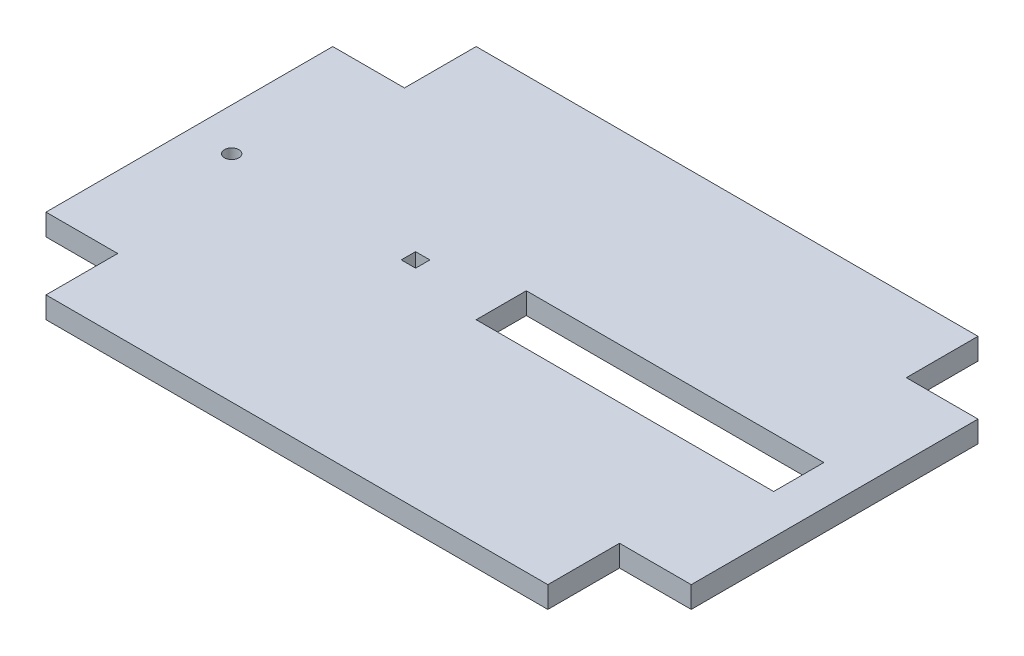
ISO-10303-21;
HEADER;
FILE_DESCRIPTION(('STEP AP214'),'2;1');
FILE_NAME('part.step','',(''),(''),'','','');
FILE_SCHEMA(('AUTOMOTIVE_DESIGN { 1 0 10303 214 1 1 1 1 }'));
ENDSEC;
DATA;
#1=APPLICATION_CONTEXT('core data for automotive mechanical design processes');
#2=APPLICATION_PROTOCOL_DEFINITION('international standard','automotive_design',2000,#1);
#3=PRODUCT_CONTEXT('',#1,'mechanical');
#4=PRODUCT('Part','Part','',(#3));
#5=PRODUCT_RELATED_PRODUCT_CATEGORY('part','',(#4));
#6=PRODUCT_DEFINITION_FORMATION('','',#4);
#7=PRODUCT_DEFINITION_CONTEXT('part definition',#1,'design');
#8=PRODUCT_DEFINITION('design','',#6,#7);
#9=PRODUCT_DEFINITION_SHAPE('','',#8);
#10=(LENGTH_UNIT() NAMED_UNIT(*) SI_UNIT(.MILLI.,.METRE.));
#11=(NAMED_UNIT(*) PLANE_ANGLE_UNIT() SI_UNIT($,.RADIAN.));
#12=(NAMED_UNIT(*) SI_UNIT($,.STERADIAN.) SOLID_ANGLE_UNIT());
#13=UNCERTAINTY_MEASURE_WITH_UNIT(LENGTH_MEASURE(1.E-05),#10,'distance_accuracy_value','');
#14=(GEOMETRIC_REPRESENTATION_CONTEXT(3) GLOBAL_UNCERTAINTY_ASSIGNED_CONTEXT((#13)) GLOBAL_UNIT_ASSIGNED_CONTEXT((#10,
#11,#12)) REPRESENTATION_CONTEXT('',''));
#15=CARTESIAN_POINT('',(0.,0.,0.));
#16=DIRECTION('',(0.,0.,1.));
#17=DIRECTION('',(1.,0.,0.));
#18=AXIS2_PLACEMENT_3D('',#15,#16,#17);
#19=CARTESIAN_POINT('',(-401.785237046629,30.,-228.803641092328));
#20=DIRECTION('',(0.,0.,1.));
#21=DIRECTION('',(1.,0.,0.));
#22=AXIS2_PLACEMENT_3D('',#19,#20,#21);
#23=PLANE('',#22);
#24=DIRECTION('',(-1.,0.,0.));
#25=VECTOR('',#24,1.);
#26=CARTESIAN_POINT('',(-401.785237046629,30.,-228.803641092328));
#27=LINE('',#26,#25);
#28=CARTESIAN_POINT('',(398.214762953372,30.,-228.803641092328));
#29=VERTEX_POINT('',#28);
#30=CARTESIAN_POINT('',(-301.785237046629,30.,-228.803641092328));
#31=VERTEX_POINT('',#30);
#32=EDGE_CURVE('E298',#29,#31,#27,.T.);
#33=ORIENTED_EDGE('',*,*,#32,.F.);
#34=DIRECTION('',(0.,1.,0.));
#35=VECTOR('',#34,1.);
#36=CARTESIAN_POINT('',(398.214762953372,0.,-228.803641092328));
#37=LINE('',#36,#35);
#38=CARTESIAN_POINT('',(398.214762953372,0.,-228.803641092328));
#39=VERTEX_POINT('',#38);
#40=EDGE_CURVE('E269',#39,#29,#37,.T.);
#41=ORIENTED_EDGE('',*,*,#40,.F.);
#42=DIRECTION('',(-1.,0.,0.));
#43=VECTOR('',#42,1.);
#44=CARTESIAN_POINT('',(-401.785237046629,0.,-228.803641092328));
#45=LINE('',#44,#43);
#46=CARTESIAN_POINT('',(-301.785237046629,0.,-228.803641092328));
#47=VERTEX_POINT('',#46);
#48=EDGE_CURVE('E294',#39,#47,#45,.T.);
#49=ORIENTED_EDGE('',*,*,#48,.T.);
#50=DIRECTION('',(0.,1.,0.));
#51=VECTOR('',#50,1.);
#52=CARTESIAN_POINT('',(-301.785237046629,0.,-228.803641092328));
#53=LINE('',#52,#51);
#54=EDGE_CURVE('E291',#47,#31,#53,.T.);
#55=ORIENTED_EDGE('',*,*,#54,.T.);
#56=EDGE_LOOP('',(#33,#41,#49,#55));
#57=FACE_BOUND('',#56,.T.);
#58=ADVANCED_FACE('F37',(#57),#23,.F.);
#59=CARTESIAN_POINT('',(-401.785237046629,30.,-228.803641092328));
#60=DIRECTION('',(1.,0.,0.));
#61=DIRECTION('',(0.,0.,-1.));
#62=AXIS2_PLACEMENT_3D('',#59,#60,#61);
#63=PLANE('',#62);
#64=DIRECTION('',(0.,0.,1.));
#65=VECTOR('',#64,1.);
#66=CARTESIAN_POINT('',(-401.785237046629,0.,-228.803641092328));
#67=LINE('',#66,#65);
#68=CARTESIAN_POINT('',(-401.785237046629,0.,-128.803641092328));
#69=VERTEX_POINT('',#68);
#70=CARTESIAN_POINT('',(-401.785237046629,0.,271.196358907672));
#71=VERTEX_POINT('',#70);
#72=EDGE_CURVE('E314',#69,#71,#67,.T.);
#73=ORIENTED_EDGE('',*,*,#72,.T.);
#74=DIRECTION('',(0.,1.,0.));
#75=VECTOR('',#74,1.);
#76=CARTESIAN_POINT('',(-401.785237046629,0.,271.196358907672));
#77=LINE('',#76,#75);
#78=CARTESIAN_POINT('',(-401.785237046629,30.,271.196358907672));
#79=VERTEX_POINT('',#78);
#80=EDGE_CURVE('E230',#71,#79,#77,.T.);
#81=ORIENTED_EDGE('',*,*,#80,.T.);
#82=DIRECTION('',(0.,0.,1.));
#83=VECTOR('',#82,1.);
#84=CARTESIAN_POINT('',(-401.785237046629,30.,-228.803641092328));
#85=LINE('',#84,#83);
#86=CARTESIAN_POINT('',(-401.785237046629,30.,-128.803641092328));
#87=VERTEX_POINT('',#86);
#88=EDGE_CURVE('E301',#87,#79,#85,.T.);
#89=ORIENTED_EDGE('',*,*,#88,.F.);
#90=DIRECTION('',(0.,1.,0.));
#91=VECTOR('',#90,1.);
#92=CARTESIAN_POINT('',(-401.785237046629,0.,-128.803641092328));
#93=LINE('',#92,#91);
#94=EDGE_CURVE('E287',#69,#87,#93,.T.);
#95=ORIENTED_EDGE('',*,*,#94,.F.);
#96=EDGE_LOOP('',(#73,#81,#89,#95));
#97=FACE_BOUND('',#96,.T.);
#98=ADVANCED_FACE('F359',(#97),#63,.F.);
#99=CARTESIAN_POINT('',(-401.785237046629,30.,371.196358907672));
#100=DIRECTION('',(0.,0.,-1.));
#101=DIRECTION('',(-1.,0.,0.));
#102=AXIS2_PLACEMENT_3D('',#99,#100,#101);
#103=PLANE('',#102);
#104=DIRECTION('',(1.,0.,0.));
#105=VECTOR('',#104,1.);
#106=CARTESIAN_POINT('',(-401.785237046629,0.,371.196358907672));
#107=LINE('',#106,#105);
#108=CARTESIAN_POINT('',(-301.785237046629,0.,371.196358907672));
#109=VERTEX_POINT('',#108);
#110=CARTESIAN_POINT('',(398.214762953372,0.,371.196358907672));
#111=VERTEX_POINT('',#110);
#112=EDGE_CURVE('E317',#109,#111,#107,.T.);
#113=ORIENTED_EDGE('',*,*,#112,.T.);
#114=DIRECTION('',(0.,1.,0.));
#115=VECTOR('',#114,1.);
#116=CARTESIAN_POINT('',(398.214762953372,0.,371.196358907672));
#117=LINE('',#116,#115);
#118=CARTESIAN_POINT('',(398.214762953372,30.,371.196358907672));
#119=VERTEX_POINT('',#118);
#120=EDGE_CURVE('E250',#111,#119,#117,.T.);
#121=ORIENTED_EDGE('',*,*,#120,.T.);
#122=DIRECTION('',(1.,0.,0.));
#123=VECTOR('',#122,1.);
#124=CARTESIAN_POINT('',(-401.785237046629,30.,371.196358907672));
#125=LINE('',#124,#123);
#126=CARTESIAN_POINT('',(-301.785237046629,30.,371.196358907672));
#127=VERTEX_POINT('',#126);
#128=EDGE_CURVE('E305',#127,#119,#125,.T.);
#129=ORIENTED_EDGE('',*,*,#128,.F.);
#130=DIRECTION('',(0.,1.,0.));
#131=VECTOR('',#130,1.);
#132=CARTESIAN_POINT('',(-301.785237046629,0.,371.196358907672));
#133=LINE('',#132,#131);
#134=EDGE_CURVE('E225',#109,#127,#133,.T.);
#135=ORIENTED_EDGE('',*,*,#134,.F.);
#136=EDGE_LOOP('',(#113,#121,#129,#135));
#137=FACE_BOUND('',#136,.T.);
#138=ADVANCED_FACE('F364',(#137),#103,.F.);
#139=CARTESIAN_POINT('',(498.214762953372,30.,371.196358907672));
#140=DIRECTION('',(-1.,0.,0.));
#141=DIRECTION('',(0.,0.,1.));
#142=AXIS2_PLACEMENT_3D('',#139,#140,#141);
#143=PLANE('',#142);
#144=DIRECTION('',(0.,0.,-1.));
#145=VECTOR('',#144,1.);
#146=CARTESIAN_POINT('',(498.214762953372,0.,371.196358907672));
#147=LINE('',#146,#145);
#148=CARTESIAN_POINT('',(498.214762953372,0.,271.196358907672));
#149=VERTEX_POINT('',#148);
#150=CARTESIAN_POINT('',(498.214762953371,0.,-128.803641092328));
#151=VERTEX_POINT('',#150);
#152=EDGE_CURVE('E302',#149,#151,#147,.T.);
#153=ORIENTED_EDGE('',*,*,#152,.T.);
#154=DIRECTION('',(0.,1.,0.));
#155=VECTOR('',#154,1.);
#156=CARTESIAN_POINT('',(498.214762953372,0.,-128.803641092328));
#157=LINE('',#156,#155);
#158=CARTESIAN_POINT('',(498.214762953372,30.,-128.803641092328));
#159=VERTEX_POINT('',#158);
#160=EDGE_CURVE('E266',#151,#159,#157,.T.);
#161=ORIENTED_EDGE('',*,*,#160,.T.);
#162=DIRECTION('',(0.,0.,-1.));
#163=VECTOR('',#162,1.);
#164=CARTESIAN_POINT('',(498.214762953372,30.,371.196358907672));
#165=LINE('',#164,#163);
#166=CARTESIAN_POINT('',(498.214762953372,30.,271.196358907672));
#167=VERTEX_POINT('',#166);
#168=EDGE_CURVE('E308',#167,#159,#165,.T.);
#169=ORIENTED_EDGE('',*,*,#168,.F.);
#170=DIRECTION('',(0.,1.,0.));
#171=VECTOR('',#170,1.);
#172=CARTESIAN_POINT('',(498.214762953372,0.,271.196358907672));
#173=LINE('',#172,#171);
#174=EDGE_CURVE('E245',#149,#167,#173,.T.);
#175=ORIENTED_EDGE('',*,*,#174,.F.);
#176=EDGE_LOOP('',(#153,#161,#169,#175));
#177=FACE_BOUND('',#176,.T.);
#178=ADVANCED_FACE('F408',(#177),#143,.F.);
#179=CARTESIAN_POINT('',(0.,30.,0.));
#180=DIRECTION('',(0.,1.,0.));
#181=DIRECTION('',(0.,0.,1.));
#182=AXIS2_PLACEMENT_3D('',#179,#180,#181);
#183=PLANE('',#182);
#184=DIRECTION('',(-1.,0.,0.));
#185=VECTOR('',#184,1.);
#186=CARTESIAN_POINT('',(443.214762953372,30.,31.1963589076722));
#187=LINE('',#186,#185);
#188=CARTESIAN_POINT('',(443.214762953372,30.,31.1963589076722));
#189=VERTEX_POINT('',#188);
#190=CARTESIAN_POINT('',(28.2147629533715,30.,31.1963589076723));
#191=VERTEX_POINT('',#190);
#192=EDGE_CURVE('E51',#189,#191,#187,.T.);
#193=ORIENTED_EDGE('',*,*,#192,.F.);
#194=DIRECTION('',(0.,0.,-1.));
#195=VECTOR('',#194,1.);
#196=CARTESIAN_POINT('',(443.214762953372,30.,31.1963589076722));
#197=LINE('',#196,#195);
#198=CARTESIAN_POINT('',(443.214762953371,30.,101.196358907672));
#199=VERTEX_POINT('',#198);
#200=EDGE_CURVE('E192',#199,#189,#197,.T.);
#201=ORIENTED_EDGE('',*,*,#200,.F.);
#202=DIRECTION('',(1.,0.,0.));
#203=VECTOR('',#202,1.);
#204=CARTESIAN_POINT('',(28.2147629533716,30.,101.196358907672));
#205=LINE('',#204,#203);
#206=CARTESIAN_POINT('',(28.2147629533716,30.,101.196358907672));
#207=VERTEX_POINT('',#206);
#208=EDGE_CURVE('E176',#207,#199,#205,.T.);
#209=ORIENTED_EDGE('',*,*,#208,.F.);
#210=DIRECTION('',(0.,0.,1.));
#211=VECTOR('',#210,1.);
#212=CARTESIAN_POINT('',(28.2147629533715,30.,31.1963589076723));
#213=LINE('',#212,#211);
#214=EDGE_CURVE('E185',#191,#207,#213,.T.);
#215=ORIENTED_EDGE('',*,*,#214,.F.);
#216=EDGE_LOOP('',(#193,#201,#209,#215));
#217=FACE_BOUND('',#216,.T.);
#218=DIRECTION('',(0.,0.,-1.));
#219=VECTOR('',#218,1.);
#220=CARTESIAN_POINT('',(-76.2852370466286,30.,81.1963589076723));
#221=LINE('',#220,#219);
#222=CARTESIAN_POINT('',(-76.2852370466286,30.,81.1963589076723));
#223=VERTEX_POINT('',#222);
#224=CARTESIAN_POINT('',(-76.2852370466286,30.,61.1963589076723));
#225=VERTEX_POINT('',#224);
#226=EDGE_CURVE('E202',#223,#225,#221,.T.);
#227=ORIENTED_EDGE('',*,*,#226,.F.);
#228=DIRECTION('',(1.,0.,0.));
#229=VECTOR('',#228,1.);
#230=CARTESIAN_POINT('',(-96.2852370466286,30.,81.1963589076723));
#231=LINE('',#230,#229);
#232=CARTESIAN_POINT('',(-96.2852370466286,30.,81.1963589076723));
#233=VERTEX_POINT('',#232);
#234=EDGE_CURVE('E210',#233,#223,#231,.T.);
#235=ORIENTED_EDGE('',*,*,#234,.F.);
#236=DIRECTION('',(0.,0.,1.));
#237=VECTOR('',#236,1.);
#238=CARTESIAN_POINT('',(-96.2852370466286,30.,81.1963589076723));
#239=LINE('',#238,#237);
#240=CARTESIAN_POINT('',(-96.2852370466286,30.,61.1963589076723));
#241=VERTEX_POINT('',#240);
#242=EDGE_CURVE('E207',#241,#233,#239,.T.);
#243=ORIENTED_EDGE('',*,*,#242,.F.);
#244=DIRECTION('',(-1.,0.,0.));
#245=VECTOR('',#244,1.);
#246=CARTESIAN_POINT('',(-96.2852370466286,30.,61.1963589076723));
#247=LINE('',#246,#245);
#248=EDGE_CURVE('E204',#225,#241,#247,.T.);
#249=ORIENTED_EDGE('',*,*,#248,.F.);
#250=EDGE_LOOP('',(#227,#235,#243,#249));
#251=FACE_BOUND('',#250,.T.);
#252=CARTESIAN_POINT('',(-342.785237046629,30.,71.1963589076723));
#253=DIRECTION('',(0.,1.,0.));
#254=DIRECTION('',(0.,0.,-1.));
#255=AXIS2_PLACEMENT_3D('',#252,#253,#254);
#256=CIRCLE('',#255,10.);
#257=CARTESIAN_POINT('',(-342.785237046629,30.,61.1963589076722));
#258=VERTEX_POINT('',#257);
#259=EDGE_CURVE('E199',#258,#258,#256,.T.);
#260=ORIENTED_EDGE('',*,*,#259,.F.);
#261=EDGE_LOOP('',(#260));
#262=FACE_BOUND('',#261,.T.);
#263=DIRECTION('',(0.,0.,1.));
#264=VECTOR('',#263,1.);
#265=CARTESIAN_POINT('',(398.214762953372,30.,-128.803641092328));
#266=LINE('',#265,#264);
#267=CARTESIAN_POINT('',(398.214762953372,30.,-128.803641092328));
#268=VERTEX_POINT('',#267);
#269=EDGE_CURVE('E253',#29,#268,#266,.T.);
#270=ORIENTED_EDGE('',*,*,#269,.F.);
#271=ORIENTED_EDGE('',*,*,#32,.T.);
#272=DIRECTION('',(0.,0.,-1.));
#273=VECTOR('',#272,1.);
#274=CARTESIAN_POINT('',(-301.785237046629,30.,-128.803641092328));
#275=LINE('',#274,#273);
#276=CARTESIAN_POINT('',(-301.785237046629,30.,-128.803641092328));
#277=VERTEX_POINT('',#276);
#278=EDGE_CURVE('E284',#277,#31,#275,.T.);
#279=ORIENTED_EDGE('',*,*,#278,.F.);
#280=DIRECTION('',(1.,0.,0.));
#281=VECTOR('',#280,1.);
#282=CARTESIAN_POINT('',(-401.785237046629,30.,-128.803641092328));
#283=LINE('',#282,#281);
#284=EDGE_CURVE('E240',#87,#277,#283,.T.);
#285=ORIENTED_EDGE('',*,*,#284,.F.);
#286=ORIENTED_EDGE('',*,*,#88,.T.);
#287=DIRECTION('',(-1.,0.,0.));
#288=VECTOR('',#287,1.);
#289=CARTESIAN_POINT('',(-301.785237046629,30.,271.196358907672));
#290=LINE('',#289,#288);
#291=CARTESIAN_POINT('',(-301.785237046629,30.,271.196358907672));
#292=VERTEX_POINT('',#291);
#293=EDGE_CURVE('E234',#292,#79,#290,.T.);
#294=ORIENTED_EDGE('',*,*,#293,.F.);
#295=DIRECTION('',(0.,0.,-1.));
#296=VECTOR('',#295,1.);
#297=CARTESIAN_POINT('',(-301.785237046629,30.,371.196358907672));
#298=LINE('',#297,#296);
#299=EDGE_CURVE('E236',#127,#292,#298,.T.);
#300=ORIENTED_EDGE('',*,*,#299,.F.);
#301=ORIENTED_EDGE('',*,*,#128,.T.);
#302=DIRECTION('',(0.,0.,1.));
#303=VECTOR('',#302,1.);
#304=CARTESIAN_POINT('',(398.214762953372,30.,271.196358907672));
#305=LINE('',#304,#303);
#306=CARTESIAN_POINT('',(398.214762953372,30.,271.196358907672));
#307=VERTEX_POINT('',#306);
#308=EDGE_CURVE('E254',#307,#119,#305,.T.);
#309=ORIENTED_EDGE('',*,*,#308,.F.);
#310=DIRECTION('',(-1.,0.,0.));
#311=VECTOR('',#310,1.);
#312=CARTESIAN_POINT('',(498.214762953372,30.,271.196358907672));
#313=LINE('',#312,#311);
#314=EDGE_CURVE('E233',#167,#307,#313,.T.);
#315=ORIENTED_EDGE('',*,*,#314,.F.);
#316=ORIENTED_EDGE('',*,*,#168,.T.);
#317=DIRECTION('',(1.,0.,0.));
#318=VECTOR('',#317,1.);
#319=CARTESIAN_POINT('',(498.214762953372,30.,-128.803641092328));
#320=LINE('',#319,#318);
#321=EDGE_CURVE('E271',#268,#159,#320,.T.);
#322=ORIENTED_EDGE('',*,*,#321,.F.);
#323=EDGE_LOOP('',(#270,#271,#279,#285,#286,#294,#300,#301,#309,#315,#316,#322));
#324=FACE_BOUND('',#323,.T.);
#325=ADVANCED_FACE('F189',(#217,#251,#262,#324),#183,.T.);
#326=CARTESIAN_POINT('',(0.,0.,0.));
#327=DIRECTION('',(0.,1.,0.));
#328=DIRECTION('',(0.,0.,1.));
#329=AXIS2_PLACEMENT_3D('',#326,#327,#328);
#330=PLANE('',#329);
#331=DIRECTION('',(0.,0.,-1.));
#332=VECTOR('',#331,1.);
#333=CARTESIAN_POINT('',(443.214762953372,0.,3.51476596203295E-13));
#334=LINE('',#333,#332);
#335=CARTESIAN_POINT('',(443.214762953371,0.,101.196358907672));
#336=VERTEX_POINT('',#335);
#337=CARTESIAN_POINT('',(443.214762953372,0.,31.1963589076722));
#338=VERTEX_POINT('',#337);
#339=EDGE_CURVE('E44',#336,#338,#334,.T.);
#340=ORIENTED_EDGE('',*,*,#339,.T.);
#341=DIRECTION('',(-1.,0.,0.));
#342=VECTOR('',#341,1.);
#343=CARTESIAN_POINT('',(0.,0.,31.1963589076723));
#344=LINE('',#343,#342);
#345=CARTESIAN_POINT('',(28.2147629533715,0.,31.1963589076723));
#346=VERTEX_POINT('',#345);
#347=EDGE_CURVE('E11',#338,#346,#344,.T.);
#348=ORIENTED_EDGE('',*,*,#347,.T.);
#349=DIRECTION('',(0.,0.,1.));
#350=VECTOR('',#349,1.);
#351=CARTESIAN_POINT('',(28.2147629533715,0.,0.));
#352=LINE('',#351,#350);
#353=CARTESIAN_POINT('',(28.2147629533716,0.,101.196358907672));
#354=VERTEX_POINT('',#353);
#355=EDGE_CURVE('E335',#346,#354,#352,.T.);
#356=ORIENTED_EDGE('',*,*,#355,.T.);
#357=DIRECTION('',(1.,0.,0.));
#358=VECTOR('',#357,1.);
#359=CARTESIAN_POINT('',(0.,0.,101.196358907672));
#360=LINE('',#359,#358);
#361=EDGE_CURVE('E179',#354,#336,#360,.T.);
#362=ORIENTED_EDGE('',*,*,#361,.T.);
#363=EDGE_LOOP('',(#340,#348,#356,#362));
#364=FACE_BOUND('',#363,.T.);
#365=DIRECTION('',(1.,0.,0.));
#366=VECTOR('',#365,1.);
#367=CARTESIAN_POINT('',(0.,0.,81.1963589076723));
#368=LINE('',#367,#366);
#369=CARTESIAN_POINT('',(-96.2852370466286,0.,81.1963589076723));
#370=VERTEX_POINT('',#369);
#371=CARTESIAN_POINT('',(-76.2852370466286,0.,81.1963589076723));
#372=VERTEX_POINT('',#371);
#373=EDGE_CURVE('E329',#370,#372,#368,.T.);
#374=ORIENTED_EDGE('',*,*,#373,.T.);
#375=DIRECTION('',(0.,0.,-1.));
#376=VECTOR('',#375,1.);
#377=CARTESIAN_POINT('',(-76.2852370466286,0.,0.));
#378=LINE('',#377,#376);
#379=CARTESIAN_POINT('',(-76.2852370466286,0.,61.1963589076723));
#380=VERTEX_POINT('',#379);
#381=EDGE_CURVE('E332',#372,#380,#378,.T.);
#382=ORIENTED_EDGE('',*,*,#381,.T.);
#383=DIRECTION('',(-1.,0.,0.));
#384=VECTOR('',#383,1.);
#385=CARTESIAN_POINT('',(0.,0.,61.1963589076723));
#386=LINE('',#385,#384);
#387=CARTESIAN_POINT('',(-96.2852370466286,0.,61.1963589076723));
#388=VERTEX_POINT('',#387);
#389=EDGE_CURVE('E311',#380,#388,#386,.T.);
#390=ORIENTED_EDGE('',*,*,#389,.T.);
#391=DIRECTION('',(0.,0.,1.));
#392=VECTOR('',#391,1.);
#393=CARTESIAN_POINT('',(-96.2852370466286,0.,0.));
#394=LINE('',#393,#392);
#395=EDGE_CURVE('E326',#388,#370,#394,.T.);
#396=ORIENTED_EDGE('',*,*,#395,.T.);
#397=EDGE_LOOP('',(#374,#382,#390,#396));
#398=FACE_BOUND('',#397,.T.);
#399=CARTESIAN_POINT('',(-342.785237046629,0.,71.1963589076723));
#400=DIRECTION('',(0.,1.,0.));
#401=DIRECTION('',(0.,0.,1.));
#402=AXIS2_PLACEMENT_3D('',#399,#400,#401);
#403=CIRCLE('',#402,10.);
#404=CARTESIAN_POINT('',(-342.785237046629,0.,81.1963589076723));
#405=VERTEX_POINT('',#404);
#406=EDGE_CURVE('E216',#405,#405,#403,.T.);
#407=ORIENTED_EDGE('',*,*,#406,.T.);
#408=EDGE_LOOP('',(#407));
#409=FACE_BOUND('',#408,.T.);
#410=ORIENTED_EDGE('',*,*,#48,.F.);
#411=DIRECTION('',(0.,0.,1.));
#412=VECTOR('',#411,1.);
#413=CARTESIAN_POINT('',(398.214762953372,0.,-128.803641092328));
#414=LINE('',#413,#412);
#415=CARTESIAN_POINT('',(398.214762953372,0.,-128.803641092328));
#416=VERTEX_POINT('',#415);
#417=EDGE_CURVE('E273',#39,#416,#414,.T.);
#418=ORIENTED_EDGE('',*,*,#417,.T.);
#419=DIRECTION('',(1.,0.,0.));
#420=VECTOR('',#419,1.);
#421=CARTESIAN_POINT('',(498.214762953372,0.,-128.803641092328));
#422=LINE('',#421,#420);
#423=EDGE_CURVE('E265',#416,#151,#422,.T.);
#424=ORIENTED_EDGE('',*,*,#423,.T.);
#425=ORIENTED_EDGE('',*,*,#152,.F.);
#426=DIRECTION('',(-1.,0.,0.));
#427=VECTOR('',#426,1.);
#428=CARTESIAN_POINT('',(498.214762953372,0.,271.196358907672));
#429=LINE('',#428,#427);
#430=CARTESIAN_POINT('',(398.214762953372,0.,271.196358907672));
#431=VERTEX_POINT('',#430);
#432=EDGE_CURVE('E256',#149,#431,#429,.T.);
#433=ORIENTED_EDGE('',*,*,#432,.T.);
#434=DIRECTION('',(0.,0.,1.));
#435=VECTOR('',#434,1.);
#436=CARTESIAN_POINT('',(398.214762953372,0.,271.196358907672));
#437=LINE('',#436,#435);
#438=EDGE_CURVE('E247',#431,#111,#437,.T.);
#439=ORIENTED_EDGE('',*,*,#438,.T.);
#440=ORIENTED_EDGE('',*,*,#112,.F.);
#441=DIRECTION('',(0.,0.,-1.));
#442=VECTOR('',#441,1.);
#443=CARTESIAN_POINT('',(-301.785237046629,0.,371.196358907672));
#444=LINE('',#443,#442);
#445=CARTESIAN_POINT('',(-301.785237046629,0.,271.196358907672));
#446=VERTEX_POINT('',#445);
#447=EDGE_CURVE('E237',#109,#446,#444,.T.);
#448=ORIENTED_EDGE('',*,*,#447,.T.);
#449=DIRECTION('',(-1.,0.,0.));
#450=VECTOR('',#449,1.);
#451=CARTESIAN_POINT('',(-301.785237046629,0.,271.196358907672));
#452=LINE('',#451,#450);
#453=EDGE_CURVE('E227',#446,#71,#452,.T.);
#454=ORIENTED_EDGE('',*,*,#453,.T.);
#455=ORIENTED_EDGE('',*,*,#72,.F.);
#456=DIRECTION('',(1.,0.,0.));
#457=VECTOR('',#456,1.);
#458=CARTESIAN_POINT('',(-401.785237046629,0.,-128.803641092328));
#459=LINE('',#458,#457);
#460=CARTESIAN_POINT('',(-301.785237046629,0.,-128.803641092328));
#461=VERTEX_POINT('',#460);
#462=EDGE_CURVE('E280',#69,#461,#459,.T.);
#463=ORIENTED_EDGE('',*,*,#462,.T.);
#464=DIRECTION('',(0.,0.,-1.));
#465=VECTOR('',#464,1.);
#466=CARTESIAN_POINT('',(-301.785237046629,0.,-128.803641092328));
#467=LINE('',#466,#465);
#468=EDGE_CURVE('E283',#461,#47,#467,.T.);
#469=ORIENTED_EDGE('',*,*,#468,.T.);
#470=EDGE_LOOP('',(#410,#418,#424,#425,#433,#439,#440,#448,#454,#455,#463,#469));
#471=FACE_BOUND('',#470,.T.);
#472=ADVANCED_FACE('F339',(#364,#398,#409,#471),#330,.F.);
#473=CARTESIAN_POINT('',(-301.785237046629,0.,-128.803641092328));
#474=DIRECTION('',(1.,0.,0.));
#475=DIRECTION('',(0.,0.,-1.));
#476=AXIS2_PLACEMENT_3D('',#473,#474,#475);
#477=PLANE('',#476);
#478=ORIENTED_EDGE('',*,*,#278,.T.);
#479=ORIENTED_EDGE('',*,*,#54,.F.);
#480=ORIENTED_EDGE('',*,*,#468,.F.);
#481=DIRECTION('',(0.,1.,0.));
#482=VECTOR('',#481,1.);
#483=CARTESIAN_POINT('',(-301.785237046629,0.,-128.803641092328));
#484=LINE('',#483,#482);
#485=EDGE_CURVE('E295',#461,#277,#484,.T.);
#486=ORIENTED_EDGE('',*,*,#485,.T.);
#487=EDGE_LOOP('',(#478,#479,#480,#486));
#488=FACE_BOUND('',#487,.T.);
#489=ADVANCED_FACE('F382',(#488),#477,.F.);
#490=CARTESIAN_POINT('',(-401.785237046629,0.,-128.803641092328));
#491=DIRECTION('',(0.,0.,1.));
#492=DIRECTION('',(1.,0.,0.));
#493=AXIS2_PLACEMENT_3D('',#490,#491,#492);
#494=PLANE('',#493);
#495=ORIENTED_EDGE('',*,*,#284,.T.);
#496=ORIENTED_EDGE('',*,*,#485,.F.);
#497=ORIENTED_EDGE('',*,*,#462,.F.);
#498=ORIENTED_EDGE('',*,*,#94,.T.);
#499=EDGE_LOOP('',(#495,#496,#497,#498));
#500=FACE_BOUND('',#499,.T.);
#501=ADVANCED_FACE('F384',(#500),#494,.F.);
#502=CARTESIAN_POINT('',(-301.785237046629,0.,271.196358907672));
#503=DIRECTION('',(0.,0.,-1.));
#504=DIRECTION('',(-1.,0.,0.));
#505=AXIS2_PLACEMENT_3D('',#502,#503,#504);
#506=PLANE('',#505);
#507=ORIENTED_EDGE('',*,*,#293,.T.);
#508=ORIENTED_EDGE('',*,*,#80,.F.);
#509=ORIENTED_EDGE('',*,*,#453,.F.);
#510=DIRECTION('',(0.,1.,0.));
#511=VECTOR('',#510,1.);
#512=CARTESIAN_POINT('',(-301.785237046629,0.,271.196358907672));
#513=LINE('',#512,#511);
#514=EDGE_CURVE('E228',#446,#292,#513,.T.);
#515=ORIENTED_EDGE('',*,*,#514,.T.);
#516=EDGE_LOOP('',(#507,#508,#509,#515));
#517=FACE_BOUND('',#516,.T.);
#518=ADVANCED_FACE('F389',(#517),#506,.F.);
#519=CARTESIAN_POINT('',(-301.785237046629,0.,371.196358907672));
#520=DIRECTION('',(1.,0.,0.));
#521=DIRECTION('',(0.,0.,-1.));
#522=AXIS2_PLACEMENT_3D('',#519,#520,#521);
#523=PLANE('',#522);
#524=ORIENTED_EDGE('',*,*,#299,.T.);
#525=ORIENTED_EDGE('',*,*,#514,.F.);
#526=ORIENTED_EDGE('',*,*,#447,.F.);
#527=ORIENTED_EDGE('',*,*,#134,.T.);
#528=EDGE_LOOP('',(#524,#525,#526,#527));
#529=FACE_BOUND('',#528,.T.);
#530=ADVANCED_FACE('F394',(#529),#523,.F.);
#531=CARTESIAN_POINT('',(398.214762953372,0.,271.196358907672));
#532=DIRECTION('',(-1.,0.,0.));
#533=DIRECTION('',(0.,0.,1.));
#534=AXIS2_PLACEMENT_3D('',#531,#532,#533);
#535=PLANE('',#534);
#536=ORIENTED_EDGE('',*,*,#308,.T.);
#537=ORIENTED_EDGE('',*,*,#120,.F.);
#538=ORIENTED_EDGE('',*,*,#438,.F.);
#539=DIRECTION('',(0.,1.,0.));
#540=VECTOR('',#539,1.);
#541=CARTESIAN_POINT('',(398.214762953372,0.,271.196358907672));
#542=LINE('',#541,#540);
#543=EDGE_CURVE('E248',#431,#307,#542,.T.);
#544=ORIENTED_EDGE('',*,*,#543,.T.);
#545=EDGE_LOOP('',(#536,#537,#538,#544));
#546=FACE_BOUND('',#545,.T.);
#547=ADVANCED_FACE('F402',(#546),#535,.F.);
#548=CARTESIAN_POINT('',(498.214762953372,0.,271.196358907672));
#549=DIRECTION('',(0.,0.,-1.));
#550=DIRECTION('',(-1.,0.,0.));
#551=AXIS2_PLACEMENT_3D('',#548,#549,#550);
#552=PLANE('',#551);
#553=ORIENTED_EDGE('',*,*,#314,.T.);
#554=ORIENTED_EDGE('',*,*,#543,.F.);
#555=ORIENTED_EDGE('',*,*,#432,.F.);
#556=ORIENTED_EDGE('',*,*,#174,.T.);
#557=EDGE_LOOP('',(#553,#554,#555,#556));
#558=FACE_BOUND('',#557,.T.);
#559=ADVANCED_FACE('F405',(#558),#552,.F.);
#560=CARTESIAN_POINT('',(398.214762953372,0.,-128.803641092328));
#561=DIRECTION('',(-1.,0.,0.));
#562=DIRECTION('',(0.,0.,1.));
#563=AXIS2_PLACEMENT_3D('',#560,#561,#562);
#564=PLANE('',#563);
#565=ORIENTED_EDGE('',*,*,#269,.T.);
#566=DIRECTION('',(0.,1.,0.));
#567=VECTOR('',#566,1.);
#568=CARTESIAN_POINT('',(398.214762953372,0.,-128.803641092328));
#569=LINE('',#568,#567);
#570=EDGE_CURVE('E263',#416,#268,#569,.T.);
#571=ORIENTED_EDGE('',*,*,#570,.F.);
#572=ORIENTED_EDGE('',*,*,#417,.F.);
#573=ORIENTED_EDGE('',*,*,#40,.T.);
#574=EDGE_LOOP('',(#565,#571,#572,#573));
#575=FACE_BOUND('',#574,.T.);
#576=ADVANCED_FACE('F375',(#575),#564,.F.);
#577=CARTESIAN_POINT('',(498.214762953372,0.,-128.803641092328));
#578=DIRECTION('',(0.,0.,1.));
#579=DIRECTION('',(1.,0.,0.));
#580=AXIS2_PLACEMENT_3D('',#577,#578,#579);
#581=PLANE('',#580);
#582=ORIENTED_EDGE('',*,*,#321,.T.);
#583=ORIENTED_EDGE('',*,*,#160,.F.);
#584=ORIENTED_EDGE('',*,*,#423,.F.);
#585=ORIENTED_EDGE('',*,*,#570,.T.);
#586=EDGE_LOOP('',(#582,#583,#584,#585));
#587=FACE_BOUND('',#586,.T.);
#588=ADVANCED_FACE('F410',(#587),#581,.F.);
#589=CARTESIAN_POINT('',(-342.785237046629,-146.,71.1963589076723));
#590=DIRECTION('',(0.,1.,0.));
#591=DIRECTION('',(0.,0.,1.));
#592=AXIS2_PLACEMENT_3D('',#589,#590,#591);
#593=CYLINDRICAL_SURFACE('',#592,10.);
#594=ORIENTED_EDGE('',*,*,#259,.T.);
#595=EDGE_LOOP('',(#594));
#596=FACE_BOUND('',#595,.T.);
#597=ORIENTED_EDGE('',*,*,#406,.F.);
#598=EDGE_LOOP('',(#597));
#599=FACE_BOUND('',#598,.T.);
#600=ADVANCED_FACE('F412',(#596,#599),#593,.F.);
#601=CARTESIAN_POINT('',(-76.2852370466286,-146.,81.1963589076723));
#602=DIRECTION('',(1.,0.,0.));
#603=DIRECTION('',(0.,0.,-1.));
#604=AXIS2_PLACEMENT_3D('',#601,#602,#603);
#605=PLANE('',#604);
#606=DIRECTION('',(0.,1.,0.));
#607=VECTOR('',#606,1.);
#608=CARTESIAN_POINT('',(-76.2852370466286,-146.,81.1963589076723));
#609=LINE('',#608,#607);
#610=EDGE_CURVE('E214',#372,#223,#609,.T.);
#611=ORIENTED_EDGE('',*,*,#610,.T.);
#612=ORIENTED_EDGE('',*,*,#226,.T.);
#613=DIRECTION('',(0.,1.,0.));
#614=VECTOR('',#613,1.);
#615=CARTESIAN_POINT('',(-76.2852370466286,-146.,61.1963589076723));
#616=LINE('',#615,#614);
#617=EDGE_CURVE('E213',#380,#225,#616,.T.);
#618=ORIENTED_EDGE('',*,*,#617,.F.);
#619=ORIENTED_EDGE('',*,*,#381,.F.);
#620=EDGE_LOOP('',(#611,#612,#618,#619));
#621=FACE_BOUND('',#620,.T.);
#622=ADVANCED_FACE('F418',(#621),#605,.F.);
#623=CARTESIAN_POINT('',(-96.2852370466286,-146.,81.1963589076723));
#624=DIRECTION('',(0.,0.,1.));
#625=DIRECTION('',(1.,0.,0.));
#626=AXIS2_PLACEMENT_3D('',#623,#624,#625);
#627=PLANE('',#626);
#628=DIRECTION('',(0.,1.,0.));
#629=VECTOR('',#628,1.);
#630=CARTESIAN_POINT('',(-96.2852370466286,-146.,81.1963589076723));
#631=LINE('',#630,#629);
#632=EDGE_CURVE('E217',#370,#233,#631,.T.);
#633=ORIENTED_EDGE('',*,*,#632,.T.);
#634=ORIENTED_EDGE('',*,*,#234,.T.);
#635=ORIENTED_EDGE('',*,*,#610,.F.);
#636=ORIENTED_EDGE('',*,*,#373,.F.);
#637=EDGE_LOOP('',(#633,#634,#635,#636));
#638=FACE_BOUND('',#637,.T.);
#639=ADVANCED_FACE('F521',(#638),#627,.F.);
#640=CARTESIAN_POINT('',(-96.2852370466286,-146.,81.1963589076723));
#641=DIRECTION('',(-1.,0.,0.));
#642=DIRECTION('',(0.,0.,1.));
#643=AXIS2_PLACEMENT_3D('',#640,#641,#642);
#644=PLANE('',#643);
#645=DIRECTION('',(0.,1.,0.));
#646=VECTOR('',#645,1.);
#647=CARTESIAN_POINT('',(-96.2852370466286,-146.,61.1963589076723));
#648=LINE('',#647,#646);
#649=EDGE_CURVE('E219',#388,#241,#648,.T.);
#650=ORIENTED_EDGE('',*,*,#649,.T.);
#651=ORIENTED_EDGE('',*,*,#242,.T.);
#652=ORIENTED_EDGE('',*,*,#632,.F.);
#653=ORIENTED_EDGE('',*,*,#395,.F.);
#654=EDGE_LOOP('',(#650,#651,#652,#653));
#655=FACE_BOUND('',#654,.T.);
#656=ADVANCED_FACE('F353',(#655),#644,.F.);
#657=CARTESIAN_POINT('',(-96.2852370466286,-146.,61.1963589076723));
#658=DIRECTION('',(0.,0.,-1.));
#659=DIRECTION('',(-1.,0.,0.));
#660=AXIS2_PLACEMENT_3D('',#657,#658,#659);
#661=PLANE('',#660);
#662=ORIENTED_EDGE('',*,*,#617,.T.);
#663=ORIENTED_EDGE('',*,*,#248,.T.);
#664=ORIENTED_EDGE('',*,*,#649,.F.);
#665=ORIENTED_EDGE('',*,*,#389,.F.);
#666=EDGE_LOOP('',(#662,#663,#664,#665));
#667=FACE_BOUND('',#666,.T.);
#668=ADVANCED_FACE('F346',(#667),#661,.F.);
#669=CARTESIAN_POINT('',(443.214762953372,-80.,31.1963589076722));
#670=DIRECTION('',(0.,0.,-1.));
#671=DIRECTION('',(-1.,0.,0.));
#672=AXIS2_PLACEMENT_3D('',#669,#670,#671);
#673=PLANE('',#672);
#674=DIRECTION('',(0.,1.,0.));
#675=VECTOR('',#674,1.);
#676=CARTESIAN_POINT('',(443.214762953372,-80.,31.1963589076722));
#677=LINE('',#676,#675);
#678=EDGE_CURVE('E197',#338,#189,#677,.T.);
#679=ORIENTED_EDGE('',*,*,#678,.T.);
#680=ORIENTED_EDGE('',*,*,#192,.T.);
#681=DIRECTION('',(0.,1.,0.));
#682=VECTOR('',#681,1.);
#683=CARTESIAN_POINT('',(28.2147629533715,-80.,31.1963589076723));
#684=LINE('',#683,#682);
#685=EDGE_CURVE('E182',#346,#191,#684,.T.);
#686=ORIENTED_EDGE('',*,*,#685,.F.);
#687=ORIENTED_EDGE('',*,*,#347,.F.);
#688=EDGE_LOOP('',(#679,#680,#686,#687));
#689=FACE_BOUND('',#688,.T.);
#690=ADVANCED_FACE('F344',(#689),#673,.F.);
#691=CARTESIAN_POINT('',(443.214762953372,-80.,31.1963589076722));
#692=DIRECTION('',(1.,0.,0.));
#693=DIRECTION('',(0.,0.,-1.));
#694=AXIS2_PLACEMENT_3D('',#691,#692,#693);
#695=PLANE('',#694);
#696=DIRECTION('',(0.,1.,0.));
#697=VECTOR('',#696,1.);
#698=CARTESIAN_POINT('',(443.214762953371,-80.,101.196358907672));
#699=LINE('',#698,#697);
#700=EDGE_CURVE('E181',#336,#199,#699,.T.);
#701=ORIENTED_EDGE('',*,*,#700,.T.);
#702=ORIENTED_EDGE('',*,*,#200,.T.);
#703=ORIENTED_EDGE('',*,*,#678,.F.);
#704=ORIENTED_EDGE('',*,*,#339,.F.);
#705=EDGE_LOOP('',(#701,#702,#703,#704));
#706=FACE_BOUND('',#705,.T.);
#707=ADVANCED_FACE('F343',(#706),#695,.F.);
#708=CARTESIAN_POINT('',(28.2147629533716,-80.,101.196358907672));
#709=DIRECTION('',(0.,0.,1.));
#710=DIRECTION('',(1.,0.,0.));
#711=AXIS2_PLACEMENT_3D('',#708,#709,#710);
#712=PLANE('',#711);
#713=DIRECTION('',(0.,1.,0.));
#714=VECTOR('',#713,1.);
#715=CARTESIAN_POINT('',(28.2147629533716,-80.,101.196358907672));
#716=LINE('',#715,#714);
#717=EDGE_CURVE('E59',#354,#207,#716,.T.);
#718=ORIENTED_EDGE('',*,*,#717,.T.);
#719=ORIENTED_EDGE('',*,*,#208,.T.);
#720=ORIENTED_EDGE('',*,*,#700,.F.);
#721=ORIENTED_EDGE('',*,*,#361,.F.);
#722=EDGE_LOOP('',(#718,#719,#720,#721));
#723=FACE_BOUND('',#722,.T.);
#724=ADVANCED_FACE('F173',(#723),#712,.F.);
#725=CARTESIAN_POINT('',(28.2147629533715,-80.,31.1963589076723));
#726=DIRECTION('',(-1.,0.,0.));
#727=DIRECTION('',(0.,0.,1.));
#728=AXIS2_PLACEMENT_3D('',#725,#726,#727);
#729=PLANE('',#728);
#730=ORIENTED_EDGE('',*,*,#685,.T.);
#731=ORIENTED_EDGE('',*,*,#214,.T.);
#732=ORIENTED_EDGE('',*,*,#717,.F.);
#733=ORIENTED_EDGE('',*,*,#355,.F.);
#734=EDGE_LOOP('',(#730,#731,#732,#733));
#735=FACE_BOUND('',#734,.T.);
#736=ADVANCED_FACE('F186',(#735),#729,.F.);
#737=CLOSED_SHELL('',(#58,#98,#138,#178,#325,#472,#489,#501,#518,#530,#547,#559,#576,#588,#600,
#622,#639,#656,#668,#690,#707,#724,#736));
#738=MANIFOLD_SOLID_BREP('B2',#737);
#739=ADVANCED_BREP_SHAPE_REPRESENTATION('',(#18,#738),#14);
#740=SHAPE_DEFINITION_REPRESENTATION(#9,#739);
ENDSEC;
END-ISO-10303-21;
